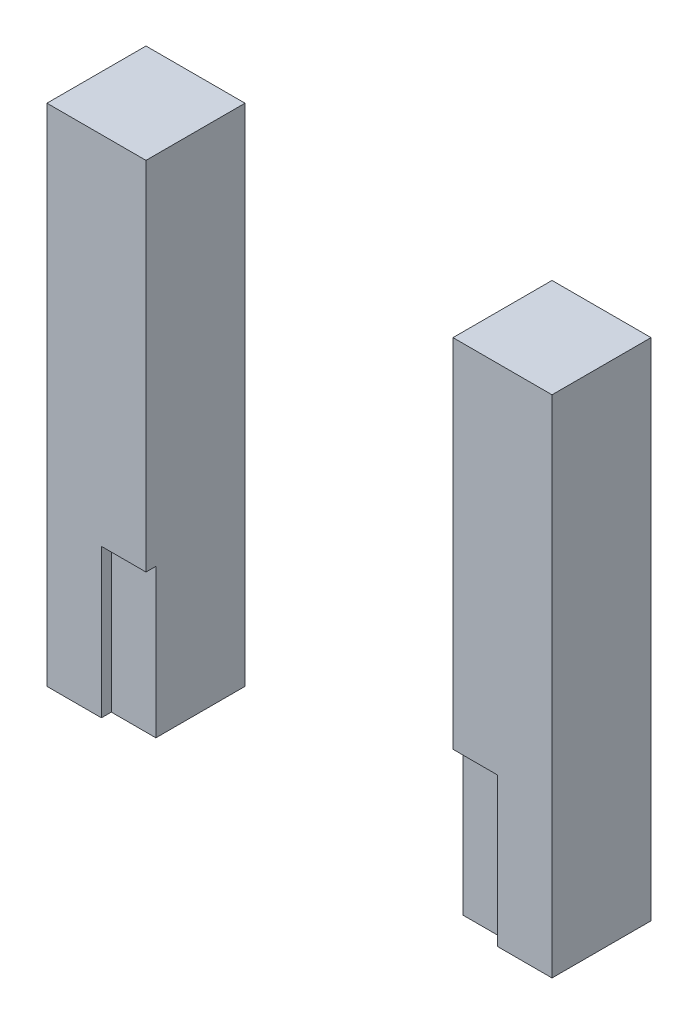
ISO-10303-21;
HEADER;
FILE_DESCRIPTION(('STEP AP214'),'2;1');
FILE_NAME('part.step','',(''),(''),'','','');
FILE_SCHEMA(('AUTOMOTIVE_DESIGN { 1 0 10303 214 1 1 1 1 }'));
ENDSEC;
DATA;
#1=APPLICATION_CONTEXT('core data for automotive mechanical design processes');
#2=APPLICATION_PROTOCOL_DEFINITION('international standard','automotive_design',2000,#1);
#3=PRODUCT_CONTEXT('',#1,'mechanical');
#4=PRODUCT('Part','Part','',(#3));
#5=PRODUCT_RELATED_PRODUCT_CATEGORY('part','',(#4));
#6=PRODUCT_DEFINITION_FORMATION('','',#4);
#7=PRODUCT_DEFINITION_CONTEXT('part definition',#1,'design');
#8=PRODUCT_DEFINITION('design','',#6,#7);
#9=PRODUCT_DEFINITION_SHAPE('','',#8);
#10=(LENGTH_UNIT() NAMED_UNIT(*) SI_UNIT(.MILLI.,.METRE.));
#11=(NAMED_UNIT(*) PLANE_ANGLE_UNIT() SI_UNIT($,.RADIAN.));
#12=(NAMED_UNIT(*) SI_UNIT($,.STERADIAN.) SOLID_ANGLE_UNIT());
#13=UNCERTAINTY_MEASURE_WITH_UNIT(LENGTH_MEASURE(1.E-05),#10,'distance_accuracy_value','');
#14=(GEOMETRIC_REPRESENTATION_CONTEXT(3) GLOBAL_UNCERTAINTY_ASSIGNED_CONTEXT((#13)) GLOBAL_UNIT_ASSIGNED_CONTEXT((#10,
#11,#12)) REPRESENTATION_CONTEXT('',''));
#15=CARTESIAN_POINT('',(0.,0.,0.));
#16=DIRECTION('',(0.,0.,1.));
#17=DIRECTION('',(1.,0.,0.));
#18=AXIS2_PLACEMENT_3D('',#15,#16,#17);
#19=CARTESIAN_POINT('',(0.,0.,50.));
#20=DIRECTION('',(0.,0.,1.));
#21=DIRECTION('',(1.,0.,0.));
#22=AXIS2_PLACEMENT_3D('',#19,#20,#21);
#23=PLANE('',#22);
#24=DIRECTION('',(0.,-1.,0.));
#25=VECTOR('',#24,1.);
#26=CARTESIAN_POINT('',(155.,255.,50.));
#27=LINE('',#26,#25);
#28=CARTESIAN_POINT('',(155.,255.,50.));
#29=VERTEX_POINT('',#28);
#30=CARTESIAN_POINT('',(155.,-105.,50.));
#31=VERTEX_POINT('',#30);
#32=EDGE_CURVE('E147',#29,#31,#27,.T.);
#33=ORIENTED_EDGE('',*,*,#32,.T.);
#34=DIRECTION('',(-1.,0.,0.));
#35=VECTOR('',#34,1.);
#36=CARTESIAN_POINT('',(-200.,-105.,50.));
#37=LINE('',#36,#35);
#38=CARTESIAN_POINT('',(200.,-105.,50.));
#39=VERTEX_POINT('',#38);
#40=EDGE_CURVE('E52',#39,#31,#37,.T.);
#41=ORIENTED_EDGE('',*,*,#40,.F.);
#42=DIRECTION('',(0.,1.,0.));
#43=VECTOR('',#42,1.);
#44=CARTESIAN_POINT('',(200.,-105.,50.));
#45=LINE('',#44,#43);
#46=CARTESIAN_POINT('',(200.,-255.,50.));
#47=VERTEX_POINT('',#46);
#48=EDGE_CURVE('E144',#47,#39,#45,.T.);
#49=ORIENTED_EDGE('',*,*,#48,.F.);
#50=DIRECTION('',(1.,0.,0.));
#51=VECTOR('',#50,1.);
#52=CARTESIAN_POINT('',(-255.,-255.,50.));
#53=LINE('',#52,#51);
#54=CARTESIAN_POINT('',(255.,-255.,50.));
#55=VERTEX_POINT('',#54);
#56=EDGE_CURVE('E148',#47,#55,#53,.T.);
#57=ORIENTED_EDGE('',*,*,#56,.T.);
#58=DIRECTION('',(0.,1.,0.));
#59=VECTOR('',#58,1.);
#60=CARTESIAN_POINT('',(255.,255.,50.));
#61=LINE('',#60,#59);
#62=CARTESIAN_POINT('',(255.,255.,50.));
#63=VERTEX_POINT('',#62);
#64=EDGE_CURVE('E149',#55,#63,#61,.T.);
#65=ORIENTED_EDGE('',*,*,#64,.T.);
#66=DIRECTION('',(-1.,0.,0.));
#67=VECTOR('',#66,1.);
#68=CARTESIAN_POINT('',(-255.,255.,50.));
#69=LINE('',#68,#67);
#70=EDGE_CURVE('E115',#63,#29,#69,.T.);
#71=ORIENTED_EDGE('',*,*,#70,.T.);
#72=EDGE_LOOP('',(#33,#41,#49,#57,#65,#71));
#73=FACE_BOUND('',#72,.T.);
#74=ADVANCED_FACE('F49',(#73),#23,.T.);
#75=CARTESIAN_POINT('',(0.,0.,-50.));
#76=DIRECTION('',(0.,0.,1.));
#77=DIRECTION('',(1.,0.,0.));
#78=AXIS2_PLACEMENT_3D('',#75,#76,#77);
#79=PLANE('',#78);
#80=DIRECTION('',(1.,0.,0.));
#81=VECTOR('',#80,1.);
#82=CARTESIAN_POINT('',(-255.,-255.,-50.));
#83=LINE('',#82,#81);
#84=CARTESIAN_POINT('',(155.,-255.,-50.));
#85=VERTEX_POINT('',#84);
#86=CARTESIAN_POINT('',(255.,-255.,-50.));
#87=VERTEX_POINT('',#86);
#88=EDGE_CURVE('E120',#85,#87,#83,.T.);
#89=ORIENTED_EDGE('',*,*,#88,.F.);
#90=DIRECTION('',(0.,1.,0.));
#91=VECTOR('',#90,1.);
#92=CARTESIAN_POINT('',(155.,155.,-50.));
#93=LINE('',#92,#91);
#94=CARTESIAN_POINT('',(155.,255.,-50.));
#95=VERTEX_POINT('',#94);
#96=EDGE_CURVE('E67',#85,#95,#93,.T.);
#97=ORIENTED_EDGE('',*,*,#96,.T.);
#98=DIRECTION('',(-1.,0.,0.));
#99=VECTOR('',#98,1.);
#100=CARTESIAN_POINT('',(-255.,255.,-50.));
#101=LINE('',#100,#99);
#102=CARTESIAN_POINT('',(255.,255.,-50.));
#103=VERTEX_POINT('',#102);
#104=EDGE_CURVE('E114',#103,#95,#101,.T.);
#105=ORIENTED_EDGE('',*,*,#104,.F.);
#106=DIRECTION('',(0.,1.,0.));
#107=VECTOR('',#106,1.);
#108=CARTESIAN_POINT('',(255.,255.,-50.));
#109=LINE('',#108,#107);
#110=EDGE_CURVE('E129',#87,#103,#109,.T.);
#111=ORIENTED_EDGE('',*,*,#110,.F.);
#112=EDGE_LOOP('',(#89,#97,#105,#111));
#113=FACE_BOUND('',#112,.T.);
#114=ADVANCED_FACE('F127',(#113),#79,.F.);
#115=CARTESIAN_POINT('',(-255.,255.,50.));
#116=DIRECTION('',(0.,-1.,0.));
#117=DIRECTION('',(0.,0.,-1.));
#118=AXIS2_PLACEMENT_3D('',#115,#116,#117);
#119=PLANE('',#118);
#120=ORIENTED_EDGE('',*,*,#104,.T.);
#121=DIRECTION('',(0.,0.,-1.));
#122=VECTOR('',#121,1.);
#123=CARTESIAN_POINT('',(155.,255.,50.));
#124=LINE('',#123,#122);
#125=EDGE_CURVE('E12',#29,#95,#124,.T.);
#126=ORIENTED_EDGE('',*,*,#125,.F.);
#127=ORIENTED_EDGE('',*,*,#70,.F.);
#128=DIRECTION('',(0.,0.,-1.));
#129=VECTOR('',#128,1.);
#130=CARTESIAN_POINT('',(255.,255.,50.));
#131=LINE('',#130,#129);
#132=EDGE_CURVE('E124',#63,#103,#131,.T.);
#133=ORIENTED_EDGE('',*,*,#132,.T.);
#134=EDGE_LOOP('',(#120,#126,#127,#133));
#135=FACE_BOUND('',#134,.T.);
#136=ADVANCED_FACE('F171',(#135),#119,.F.);
#137=CARTESIAN_POINT('',(-255.,-255.,50.));
#138=DIRECTION('',(0.,1.,0.));
#139=DIRECTION('',(0.,0.,1.));
#140=AXIS2_PLACEMENT_3D('',#137,#138,#139);
#141=PLANE('',#140);
#142=DIRECTION('',(1.,0.,0.));
#143=VECTOR('',#142,1.);
#144=CARTESIAN_POINT('',(-200.,-255.,40.));
#145=LINE('',#144,#143);
#146=CARTESIAN_POINT('',(155.,-255.,40.));
#147=VERTEX_POINT('',#146);
#148=CARTESIAN_POINT('',(200.,-255.,40.));
#149=VERTEX_POINT('',#148);
#150=EDGE_CURVE('E123',#147,#149,#145,.T.);
#151=ORIENTED_EDGE('',*,*,#150,.F.);
#152=DIRECTION('',(0.,0.,-1.));
#153=VECTOR('',#152,1.);
#154=CARTESIAN_POINT('',(155.,-255.,50.));
#155=LINE('',#154,#153);
#156=EDGE_CURVE('E110',#147,#85,#155,.T.);
#157=ORIENTED_EDGE('',*,*,#156,.T.);
#158=ORIENTED_EDGE('',*,*,#88,.T.);
#159=DIRECTION('',(0.,0.,-1.));
#160=VECTOR('',#159,1.);
#161=CARTESIAN_POINT('',(255.,-255.,50.));
#162=LINE('',#161,#160);
#163=EDGE_CURVE('E139',#55,#87,#162,.T.);
#164=ORIENTED_EDGE('',*,*,#163,.F.);
#165=ORIENTED_EDGE('',*,*,#56,.F.);
#166=DIRECTION('',(0.,0.,1.));
#167=VECTOR('',#166,1.);
#168=CARTESIAN_POINT('',(200.,-255.,40.));
#169=LINE('',#168,#167);
#170=EDGE_CURVE('E58',#149,#47,#169,.T.);
#171=ORIENTED_EDGE('',*,*,#170,.F.);
#172=EDGE_LOOP('',(#151,#157,#158,#164,#165,#171));
#173=FACE_BOUND('',#172,.T.);
#174=ADVANCED_FACE('F118',(#173),#141,.F.);
#175=CARTESIAN_POINT('',(0.,0.,40.));
#176=DIRECTION('',(0.,0.,1.));
#177=DIRECTION('',(1.,0.,0.));
#178=AXIS2_PLACEMENT_3D('',#175,#176,#177);
#179=PLANE('',#178);
#180=DIRECTION('',(0.,1.,0.));
#181=VECTOR('',#180,1.);
#182=CARTESIAN_POINT('',(155.,155.,40.));
#183=LINE('',#182,#181);
#184=CARTESIAN_POINT('',(155.,-105.,40.));
#185=VERTEX_POINT('',#184);
#186=EDGE_CURVE('E104',#147,#185,#183,.T.);
#187=ORIENTED_EDGE('',*,*,#186,.F.);
#188=ORIENTED_EDGE('',*,*,#150,.T.);
#189=DIRECTION('',(0.,1.,0.));
#190=VECTOR('',#189,1.);
#191=CARTESIAN_POINT('',(200.,-105.,40.));
#192=LINE('',#191,#190);
#193=CARTESIAN_POINT('',(200.,-105.,40.));
#194=VERTEX_POINT('',#193);
#195=EDGE_CURVE('E131',#149,#194,#192,.T.);
#196=ORIENTED_EDGE('',*,*,#195,.T.);
#197=DIRECTION('',(-1.,0.,0.));
#198=VECTOR('',#197,1.);
#199=CARTESIAN_POINT('',(-200.,-105.,40.));
#200=LINE('',#199,#198);
#201=EDGE_CURVE('E136',#194,#185,#200,.T.);
#202=ORIENTED_EDGE('',*,*,#201,.T.);
#203=EDGE_LOOP('',(#187,#188,#196,#202));
#204=FACE_BOUND('',#203,.T.);
#205=ADVANCED_FACE('F184',(#204),#179,.T.);
#206=CARTESIAN_POINT('',(255.,255.,50.));
#207=DIRECTION('',(-1.,0.,0.));
#208=DIRECTION('',(0.,-1.,0.));
#209=AXIS2_PLACEMENT_3D('',#206,#207,#208);
#210=PLANE('',#209);
#211=ORIENTED_EDGE('',*,*,#110,.T.);
#212=ORIENTED_EDGE('',*,*,#132,.F.);
#213=ORIENTED_EDGE('',*,*,#64,.F.);
#214=ORIENTED_EDGE('',*,*,#163,.T.);
#215=EDGE_LOOP('',(#211,#212,#213,#214));
#216=FACE_BOUND('',#215,.T.);
#217=ADVANCED_FACE('F186',(#216),#210,.F.);
#218=CARTESIAN_POINT('',(155.,155.,50.));
#219=DIRECTION('',(-1.,0.,0.));
#220=DIRECTION('',(0.,-1.,0.));
#221=AXIS2_PLACEMENT_3D('',#218,#219,#220);
#222=PLANE('',#221);
#223=DIRECTION('',(0.,0.,-1.));
#224=VECTOR('',#223,1.);
#225=CARTESIAN_POINT('',(155.,-105.,50.));
#226=LINE('',#225,#224);
#227=EDGE_CURVE('E160',#31,#185,#226,.T.);
#228=ORIENTED_EDGE('',*,*,#227,.F.);
#229=ORIENTED_EDGE('',*,*,#32,.F.);
#230=ORIENTED_EDGE('',*,*,#125,.T.);
#231=ORIENTED_EDGE('',*,*,#96,.F.);
#232=ORIENTED_EDGE('',*,*,#156,.F.);
#233=ORIENTED_EDGE('',*,*,#186,.T.);
#234=EDGE_LOOP('',(#228,#229,#230,#231,#232,#233));
#235=FACE_BOUND('',#234,.T.);
#236=ADVANCED_FACE('F109',(#235),#222,.T.);
#237=CARTESIAN_POINT('',(-200.,-105.,40.));
#238=DIRECTION('',(0.,1.,0.));
#239=DIRECTION('',(0.,0.,1.));
#240=AXIS2_PLACEMENT_3D('',#237,#238,#239);
#241=PLANE('',#240);
#242=ORIENTED_EDGE('',*,*,#227,.T.);
#243=ORIENTED_EDGE('',*,*,#201,.F.);
#244=DIRECTION('',(0.,0.,1.));
#245=VECTOR('',#244,1.);
#246=CARTESIAN_POINT('',(200.,-105.,40.));
#247=LINE('',#246,#245);
#248=EDGE_CURVE('E162',#194,#39,#247,.T.);
#249=ORIENTED_EDGE('',*,*,#248,.T.);
#250=ORIENTED_EDGE('',*,*,#40,.T.);
#251=EDGE_LOOP('',(#242,#243,#249,#250));
#252=FACE_BOUND('',#251,.T.);
#253=ADVANCED_FACE('F169',(#252),#241,.F.);
#254=CARTESIAN_POINT('',(200.,-105.,40.));
#255=DIRECTION('',(1.,0.,0.));
#256=DIRECTION('',(0.,1.,0.));
#257=AXIS2_PLACEMENT_3D('',#254,#255,#256);
#258=PLANE('',#257);
#259=ORIENTED_EDGE('',*,*,#48,.T.);
#260=ORIENTED_EDGE('',*,*,#248,.F.);
#261=ORIENTED_EDGE('',*,*,#195,.F.);
#262=ORIENTED_EDGE('',*,*,#170,.T.);
#263=EDGE_LOOP('',(#259,#260,#261,#262));
#264=FACE_BOUND('',#263,.T.);
#265=ADVANCED_FACE('F190',(#264),#258,.F.);
#266=CLOSED_SHELL('',(#74,#114,#136,#174,#205,#217,#236,#253,#265));
#267=MANIFOLD_SOLID_BREP('B2',#266);
#268=CARTESIAN_POINT('',(-255.,255.,50.));
#269=DIRECTION('',(1.,0.,0.));
#270=DIRECTION('',(0.,1.,0.));
#271=AXIS2_PLACEMENT_3D('',#268,#269,#270);
#272=PLANE('',#271);
#273=DIRECTION('',(0.,-1.,0.));
#274=VECTOR('',#273,1.);
#275=CARTESIAN_POINT('',(-255.,255.,-50.));
#276=LINE('',#275,#274);
#277=CARTESIAN_POINT('',(-255.,255.,-50.));
#278=VERTEX_POINT('',#277);
#279=CARTESIAN_POINT('',(-255.,-255.,-50.));
#280=VERTEX_POINT('',#279);
#281=EDGE_CURVE('E349',#278,#280,#276,.T.);
#282=ORIENTED_EDGE('',*,*,#281,.T.);
#283=DIRECTION('',(0.,0.,-1.));
#284=VECTOR('',#283,1.);
#285=CARTESIAN_POINT('',(-255.,-255.,50.));
#286=LINE('',#285,#284);
#287=CARTESIAN_POINT('',(-255.,-255.,50.));
#288=VERTEX_POINT('',#287);
#289=EDGE_CURVE('E346',#288,#280,#286,.T.);
#290=ORIENTED_EDGE('',*,*,#289,.F.);
#291=DIRECTION('',(0.,-1.,0.));
#292=VECTOR('',#291,1.);
#293=CARTESIAN_POINT('',(-255.,255.,50.));
#294=LINE('',#293,#292);
#295=CARTESIAN_POINT('',(-255.,255.,50.));
#296=VERTEX_POINT('',#295);
#297=EDGE_CURVE('E275',#296,#288,#294,.T.);
#298=ORIENTED_EDGE('',*,*,#297,.F.);
#299=DIRECTION('',(0.,0.,-1.));
#300=VECTOR('',#299,1.);
#301=CARTESIAN_POINT('',(-255.,255.,50.));
#302=LINE('',#301,#300);
#303=EDGE_CURVE('E267',#296,#278,#302,.T.);
#304=ORIENTED_EDGE('',*,*,#303,.T.);
#305=EDGE_LOOP('',(#282,#290,#298,#304));
#306=FACE_BOUND('',#305,.T.);
#307=ADVANCED_FACE('F257',(#306),#272,.F.);
#308=CARTESIAN_POINT('',(-200.,-105.,40.));
#309=DIRECTION('',(-1.,0.,0.));
#310=DIRECTION('',(0.,-1.,0.));
#311=AXIS2_PLACEMENT_3D('',#308,#309,#310);
#312=PLANE('',#311);
#313=DIRECTION('',(0.,-1.,0.));
#314=VECTOR('',#313,1.);
#315=CARTESIAN_POINT('',(-200.,-105.,50.));
#316=LINE('',#315,#314);
#317=CARTESIAN_POINT('',(-200.,-105.,50.));
#318=VERTEX_POINT('',#317);
#319=CARTESIAN_POINT('',(-200.,-255.,50.));
#320=VERTEX_POINT('',#319);
#321=EDGE_CURVE('E375',#318,#320,#316,.T.);
#322=ORIENTED_EDGE('',*,*,#321,.T.);
#323=DIRECTION('',(0.,0.,1.));
#324=VECTOR('',#323,1.);
#325=CARTESIAN_POINT('',(-200.,-255.,40.));
#326=LINE('',#325,#324);
#327=CARTESIAN_POINT('',(-200.,-255.,40.));
#328=VERTEX_POINT('',#327);
#329=EDGE_CURVE('E387',#328,#320,#326,.T.);
#330=ORIENTED_EDGE('',*,*,#329,.F.);
#331=DIRECTION('',(0.,-1.,0.));
#332=VECTOR('',#331,1.);
#333=CARTESIAN_POINT('',(-200.,-105.,40.));
#334=LINE('',#333,#332);
#335=CARTESIAN_POINT('',(-200.,-105.,40.));
#336=VERTEX_POINT('',#335);
#337=EDGE_CURVE('E374',#336,#328,#334,.T.);
#338=ORIENTED_EDGE('',*,*,#337,.F.);
#339=DIRECTION('',(0.,0.,1.));
#340=VECTOR('',#339,1.);
#341=CARTESIAN_POINT('',(-200.,-105.,40.));
#342=LINE('',#341,#340);
#343=EDGE_CURVE('E382',#336,#318,#342,.T.);
#344=ORIENTED_EDGE('',*,*,#343,.T.);
#345=EDGE_LOOP('',(#322,#330,#338,#344));
#346=FACE_BOUND('',#345,.T.);
#347=ADVANCED_FACE('F402',(#346),#312,.F.);
#348=CARTESIAN_POINT('',(-200.,-105.,40.));
#349=DIRECTION('',(0.,1.,0.));
#350=DIRECTION('',(0.,0.,1.));
#351=AXIS2_PLACEMENT_3D('',#348,#349,#350);
#352=PLANE('',#351);
#353=DIRECTION('',(0.,0.,1.));
#354=VECTOR('',#353,1.);
#355=CARTESIAN_POINT('',(-155.,-105.,50.));
#356=LINE('',#355,#354);
#357=CARTESIAN_POINT('',(-155.,-105.,40.));
#358=VERTEX_POINT('',#357);
#359=CARTESIAN_POINT('',(-155.,-105.,50.));
#360=VERTEX_POINT('',#359);
#361=EDGE_CURVE('E47',#358,#360,#356,.T.);
#362=ORIENTED_EDGE('',*,*,#361,.T.);
#363=DIRECTION('',(-1.,0.,0.));
#364=VECTOR('',#363,1.);
#365=CARTESIAN_POINT('',(-200.,-105.,50.));
#366=LINE('',#365,#364);
#367=EDGE_CURVE('E340',#360,#318,#366,.T.);
#368=ORIENTED_EDGE('',*,*,#367,.T.);
#369=ORIENTED_EDGE('',*,*,#343,.F.);
#370=DIRECTION('',(-1.,0.,0.));
#371=VECTOR('',#370,1.);
#372=CARTESIAN_POINT('',(-200.,-105.,40.));
#373=LINE('',#372,#371);
#374=EDGE_CURVE('E371',#358,#336,#373,.T.);
#375=ORIENTED_EDGE('',*,*,#374,.F.);
#376=EDGE_LOOP('',(#362,#368,#369,#375));
#377=FACE_BOUND('',#376,.T.);
#378=ADVANCED_FACE('F406',(#377),#352,.F.);
#379=CARTESIAN_POINT('',(-255.,255.,50.));
#380=DIRECTION('',(0.,-1.,0.));
#381=DIRECTION('',(0.,0.,-1.));
#382=AXIS2_PLACEMENT_3D('',#379,#380,#381);
#383=PLANE('',#382);
#384=DIRECTION('',(-1.,0.,0.));
#385=VECTOR('',#384,1.);
#386=CARTESIAN_POINT('',(-255.,255.,50.));
#387=LINE('',#386,#385);
#388=CARTESIAN_POINT('',(-155.,255.,50.));
#389=VERTEX_POINT('',#388);
#390=EDGE_CURVE('E348',#389,#296,#387,.T.);
#391=ORIENTED_EDGE('',*,*,#390,.F.);
#392=DIRECTION('',(0.,0.,-1.));
#393=VECTOR('',#392,1.);
#394=CARTESIAN_POINT('',(-155.,255.,50.));
#395=LINE('',#394,#393);
#396=CARTESIAN_POINT('',(-155.,255.,-50.));
#397=VERTEX_POINT('',#396);
#398=EDGE_CURVE('E341',#389,#397,#395,.T.);
#399=ORIENTED_EDGE('',*,*,#398,.T.);
#400=DIRECTION('',(-1.,0.,0.));
#401=VECTOR('',#400,1.);
#402=CARTESIAN_POINT('',(-255.,255.,-50.));
#403=LINE('',#402,#401);
#404=EDGE_CURVE('E286',#397,#278,#403,.T.);
#405=ORIENTED_EDGE('',*,*,#404,.T.);
#406=ORIENTED_EDGE('',*,*,#303,.F.);
#407=EDGE_LOOP('',(#391,#399,#405,#406));
#408=FACE_BOUND('',#407,.T.);
#409=ADVANCED_FACE('F259',(#408),#383,.F.);
#410=CARTESIAN_POINT('',(0.,0.,40.));
#411=DIRECTION('',(0.,0.,1.));
#412=DIRECTION('',(1.,0.,0.));
#413=AXIS2_PLACEMENT_3D('',#410,#411,#412);
#414=PLANE('',#413);
#415=DIRECTION('',(1.,0.,0.));
#416=VECTOR('',#415,1.);
#417=CARTESIAN_POINT('',(-200.,-255.,40.));
#418=LINE('',#417,#416);
#419=CARTESIAN_POINT('',(-155.,-255.,40.));
#420=VERTEX_POINT('',#419);
#421=EDGE_CURVE('E379',#328,#420,#418,.T.);
#422=ORIENTED_EDGE('',*,*,#421,.T.);
#423=DIRECTION('',(0.,-1.,0.));
#424=VECTOR('',#423,1.);
#425=CARTESIAN_POINT('',(-155.,155.,40.));
#426=LINE('',#425,#424);
#427=EDGE_CURVE('E295',#358,#420,#426,.T.);
#428=ORIENTED_EDGE('',*,*,#427,.F.);
#429=ORIENTED_EDGE('',*,*,#374,.T.);
#430=ORIENTED_EDGE('',*,*,#337,.T.);
#431=EDGE_LOOP('',(#422,#428,#429,#430));
#432=FACE_BOUND('',#431,.T.);
#433=ADVANCED_FACE('F403',(#432),#414,.T.);
#434=CARTESIAN_POINT('',(-155.,155.,50.));
#435=DIRECTION('',(1.,0.,0.));
#436=DIRECTION('',(0.,1.,0.));
#437=AXIS2_PLACEMENT_3D('',#434,#435,#436);
#438=PLANE('',#437);
#439=ORIENTED_EDGE('',*,*,#361,.F.);
#440=ORIENTED_EDGE('',*,*,#427,.T.);
#441=DIRECTION('',(0.,0.,-1.));
#442=VECTOR('',#441,1.);
#443=CARTESIAN_POINT('',(-155.,-255.,50.));
#444=LINE('',#443,#442);
#445=CARTESIAN_POINT('',(-155.,-255.,-50.));
#446=VERTEX_POINT('',#445);
#447=EDGE_CURVE('E334',#420,#446,#444,.T.);
#448=ORIENTED_EDGE('',*,*,#447,.T.);
#449=DIRECTION('',(0.,-1.,0.));
#450=VECTOR('',#449,1.);
#451=CARTESIAN_POINT('',(-155.,155.,-50.));
#452=LINE('',#451,#450);
#453=EDGE_CURVE('E322',#397,#446,#452,.T.);
#454=ORIENTED_EDGE('',*,*,#453,.F.);
#455=ORIENTED_EDGE('',*,*,#398,.F.);
#456=DIRECTION('',(0.,-1.,0.));
#457=VECTOR('',#456,1.);
#458=CARTESIAN_POINT('',(-155.,155.,50.));
#459=LINE('',#458,#457);
#460=EDGE_CURVE('E331',#389,#360,#459,.T.);
#461=ORIENTED_EDGE('',*,*,#460,.T.);
#462=EDGE_LOOP('',(#439,#440,#448,#454,#455,#461));
#463=FACE_BOUND('',#462,.T.);
#464=ADVANCED_FACE('F336',(#463),#438,.T.);
#465=CARTESIAN_POINT('',(-255.,-255.,50.));
#466=DIRECTION('',(0.,1.,0.));
#467=DIRECTION('',(0.,0.,1.));
#468=AXIS2_PLACEMENT_3D('',#465,#466,#467);
#469=PLANE('',#468);
#470=DIRECTION('',(1.,0.,0.));
#471=VECTOR('',#470,1.);
#472=CARTESIAN_POINT('',(-255.,-255.,-50.));
#473=LINE('',#472,#471);
#474=EDGE_CURVE('E327',#280,#446,#473,.T.);
#475=ORIENTED_EDGE('',*,*,#474,.T.);
#476=ORIENTED_EDGE('',*,*,#447,.F.);
#477=ORIENTED_EDGE('',*,*,#421,.F.);
#478=ORIENTED_EDGE('',*,*,#329,.T.);
#479=DIRECTION('',(1.,0.,0.));
#480=VECTOR('',#479,1.);
#481=CARTESIAN_POINT('',(-255.,-255.,50.));
#482=LINE('',#481,#480);
#483=EDGE_CURVE('E358',#288,#320,#482,.T.);
#484=ORIENTED_EDGE('',*,*,#483,.F.);
#485=ORIENTED_EDGE('',*,*,#289,.T.);
#486=EDGE_LOOP('',(#475,#476,#477,#478,#484,#485));
#487=FACE_BOUND('',#486,.T.);
#488=ADVANCED_FACE('F344',(#487),#469,.F.);
#489=CARTESIAN_POINT('',(0.,0.,-50.));
#490=DIRECTION('',(0.,0.,1.));
#491=DIRECTION('',(1.,0.,0.));
#492=AXIS2_PLACEMENT_3D('',#489,#490,#491);
#493=PLANE('',#492);
#494=ORIENTED_EDGE('',*,*,#453,.T.);
#495=ORIENTED_EDGE('',*,*,#474,.F.);
#496=ORIENTED_EDGE('',*,*,#281,.F.);
#497=ORIENTED_EDGE('',*,*,#404,.F.);
#498=EDGE_LOOP('',(#494,#495,#496,#497));
#499=FACE_BOUND('',#498,.T.);
#500=ADVANCED_FACE('F324',(#499),#493,.F.);
#501=CARTESIAN_POINT('',(0.,0.,50.));
#502=DIRECTION('',(0.,0.,1.));
#503=DIRECTION('',(1.,0.,0.));
#504=AXIS2_PLACEMENT_3D('',#501,#502,#503);
#505=PLANE('',#504);
#506=ORIENTED_EDGE('',*,*,#460,.F.);
#507=ORIENTED_EDGE('',*,*,#390,.T.);
#508=ORIENTED_EDGE('',*,*,#297,.T.);
#509=ORIENTED_EDGE('',*,*,#483,.T.);
#510=ORIENTED_EDGE('',*,*,#321,.F.);
#511=ORIENTED_EDGE('',*,*,#367,.F.);
#512=EDGE_LOOP('',(#506,#507,#508,#509,#510,#511));
#513=FACE_BOUND('',#512,.T.);
#514=ADVANCED_FACE('F362',(#513),#505,.T.);
#515=CLOSED_SHELL('',(#307,#347,#378,#409,#433,#464,#488,#500,#514));
#516=MANIFOLD_SOLID_BREP('B6',#515);
#517=ADVANCED_BREP_SHAPE_REPRESENTATION('',(#18,#267,#516),#14);
#518=SHAPE_DEFINITION_REPRESENTATION(#9,#517);
ENDSEC;
END-ISO-10303-21;
